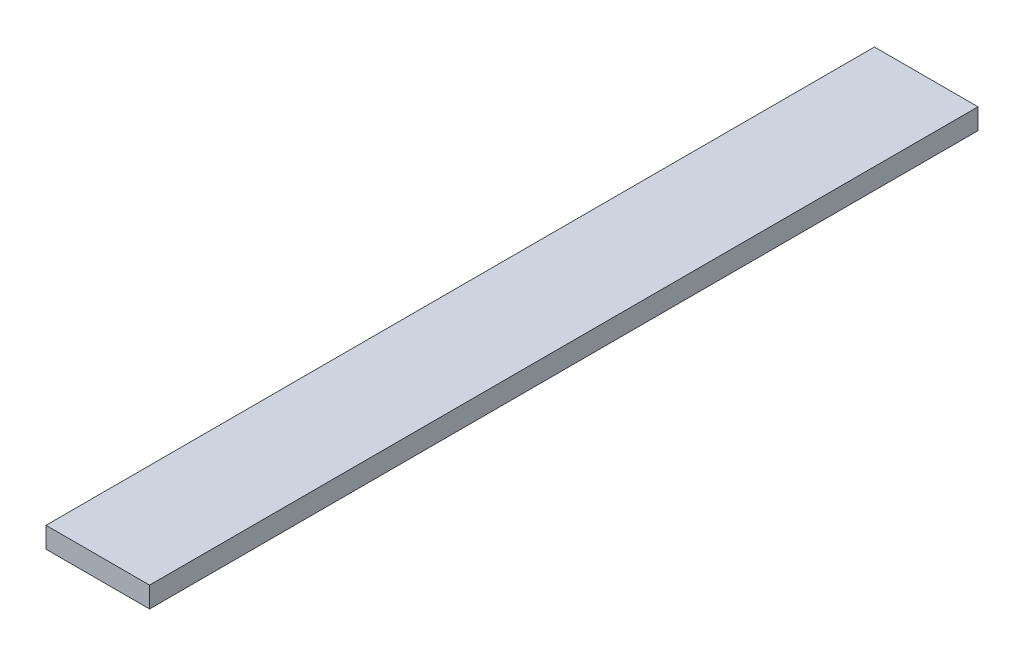
ISO-10303-21;
HEADER;
FILE_DESCRIPTION(('STEP AP214'),'2;1');
FILE_NAME('part.step','',(''),(''),'','','');
FILE_SCHEMA(('AUTOMOTIVE_DESIGN { 1 0 10303 214 1 1 1 1 }'));
ENDSEC;
DATA;
#1=APPLICATION_CONTEXT('core data for automotive mechanical design processes');
#2=APPLICATION_PROTOCOL_DEFINITION('international standard','automotive_design',2000,#1);
#3=PRODUCT_CONTEXT('',#1,'mechanical');
#4=PRODUCT('Part','Part','',(#3));
#5=PRODUCT_RELATED_PRODUCT_CATEGORY('part','',(#4));
#6=PRODUCT_DEFINITION_FORMATION('','',#4);
#7=PRODUCT_DEFINITION_CONTEXT('part definition',#1,'design');
#8=PRODUCT_DEFINITION('design','',#6,#7);
#9=PRODUCT_DEFINITION_SHAPE('','',#8);
#10=(LENGTH_UNIT() NAMED_UNIT(*) SI_UNIT(.MILLI.,.METRE.));
#11=(NAMED_UNIT(*) PLANE_ANGLE_UNIT() SI_UNIT($,.RADIAN.));
#12=(NAMED_UNIT(*) SI_UNIT($,.STERADIAN.) SOLID_ANGLE_UNIT());
#13=UNCERTAINTY_MEASURE_WITH_UNIT(LENGTH_MEASURE(1.E-05),#10,'distance_accuracy_value','');
#14=(GEOMETRIC_REPRESENTATION_CONTEXT(3) GLOBAL_UNCERTAINTY_ASSIGNED_CONTEXT((#13)) GLOBAL_UNIT_ASSIGNED_CONTEXT((#10,
#11,#12)) REPRESENTATION_CONTEXT('',''));
#15=CARTESIAN_POINT('',(0.,0.,0.));
#16=DIRECTION('',(0.,0.,1.));
#17=DIRECTION('',(1.,0.,0.));
#18=AXIS2_PLACEMENT_3D('',#15,#16,#17);
#19=CARTESIAN_POINT('',(7.5,3.,0.));
#20=DIRECTION('',(1.,0.,0.));
#21=DIRECTION('',(0.,0.,-1.));
#22=AXIS2_PLACEMENT_3D('',#19,#20,#21);
#23=PLANE('',#22);
#24=DIRECTION('',(0.,0.,1.));
#25=VECTOR('',#24,1.);
#26=CARTESIAN_POINT('',(7.5,0.,0.));
#27=LINE('',#26,#25);
#28=CARTESIAN_POINT('',(7.49999999999999,0.,-60.));
#29=VERTEX_POINT('',#28);
#30=CARTESIAN_POINT('',(7.50000000000001,0.,60.));
#31=VERTEX_POINT('',#30);
#32=EDGE_CURVE('E114',#29,#31,#27,.T.);
#33=ORIENTED_EDGE('',*,*,#32,.F.);
#34=DIRECTION('',(0.,-1.,0.));
#35=VECTOR('',#34,1.);
#36=CARTESIAN_POINT('',(7.49999999999999,3.,-60.));
#37=LINE('',#36,#35);
#38=CARTESIAN_POINT('',(7.49999999999999,3.,-60.));
#39=VERTEX_POINT('',#38);
#40=EDGE_CURVE('E11',#39,#29,#37,.T.);
#41=ORIENTED_EDGE('',*,*,#40,.F.);
#42=DIRECTION('',(0.,0.,1.));
#43=VECTOR('',#42,1.);
#44=CARTESIAN_POINT('',(7.5,3.,0.));
#45=LINE('',#44,#43);
#46=CARTESIAN_POINT('',(7.50000000000001,3.,60.));
#47=VERTEX_POINT('',#46);
#48=EDGE_CURVE('E105',#39,#47,#45,.T.);
#49=ORIENTED_EDGE('',*,*,#48,.T.);
#50=DIRECTION('',(0.,-1.,0.));
#51=VECTOR('',#50,1.);
#52=CARTESIAN_POINT('',(7.50000000000001,3.,60.));
#53=LINE('',#52,#51);
#54=EDGE_CURVE('E84',#47,#31,#53,.T.);
#55=ORIENTED_EDGE('',*,*,#54,.T.);
#56=EDGE_LOOP('',(#33,#41,#49,#55));
#57=FACE_BOUND('',#56,.T.);
#58=ADVANCED_FACE('F45',(#57),#23,.T.);
#59=CARTESIAN_POINT('',(0.,3.,-60.));
#60=DIRECTION('',(0.,0.,-1.));
#61=DIRECTION('',(-1.,0.,0.));
#62=AXIS2_PLACEMENT_3D('',#59,#60,#61);
#63=PLANE('',#62);
#64=DIRECTION('',(1.,0.,0.));
#65=VECTOR('',#64,1.);
#66=CARTESIAN_POINT('',(0.,0.,-60.));
#67=LINE('',#66,#65);
#68=CARTESIAN_POINT('',(-7.50000000000001,0.,-60.));
#69=VERTEX_POINT('',#68);
#70=EDGE_CURVE('E97',#69,#29,#67,.T.);
#71=ORIENTED_EDGE('',*,*,#70,.F.);
#72=DIRECTION('',(0.,-1.,0.));
#73=VECTOR('',#72,1.);
#74=CARTESIAN_POINT('',(-7.50000000000001,3.,-60.));
#75=LINE('',#74,#73);
#76=CARTESIAN_POINT('',(-7.50000000000001,3.,-60.));
#77=VERTEX_POINT('',#76);
#78=EDGE_CURVE('E54',#77,#69,#75,.T.);
#79=ORIENTED_EDGE('',*,*,#78,.F.);
#80=DIRECTION('',(1.,0.,0.));
#81=VECTOR('',#80,1.);
#82=CARTESIAN_POINT('',(0.,3.,-60.));
#83=LINE('',#82,#81);
#84=EDGE_CURVE('E95',#77,#39,#83,.T.);
#85=ORIENTED_EDGE('',*,*,#84,.T.);
#86=ORIENTED_EDGE('',*,*,#40,.T.);
#87=EDGE_LOOP('',(#71,#79,#85,#86));
#88=FACE_BOUND('',#87,.T.);
#89=ADVANCED_FACE('F93',(#88),#63,.T.);
#90=CARTESIAN_POINT('',(-7.5,3.,0.));
#91=DIRECTION('',(1.,0.,0.));
#92=DIRECTION('',(0.,0.,-1.));
#93=AXIS2_PLACEMENT_3D('',#90,#91,#92);
#94=PLANE('',#93);
#95=DIRECTION('',(0.,0.,1.));
#96=VECTOR('',#95,1.);
#97=CARTESIAN_POINT('',(-7.5,0.,0.));
#98=LINE('',#97,#96);
#99=CARTESIAN_POINT('',(-7.49999999999999,0.,60.));
#100=VERTEX_POINT('',#99);
#101=EDGE_CURVE('E77',#69,#100,#98,.T.);
#102=ORIENTED_EDGE('',*,*,#101,.T.);
#103=DIRECTION('',(0.,-1.,0.));
#104=VECTOR('',#103,1.);
#105=CARTESIAN_POINT('',(-7.49999999999999,3.,60.));
#106=LINE('',#105,#104);
#107=CARTESIAN_POINT('',(-7.49999999999999,3.,60.));
#108=VERTEX_POINT('',#107);
#109=EDGE_CURVE('E99',#108,#100,#106,.T.);
#110=ORIENTED_EDGE('',*,*,#109,.F.);
#111=DIRECTION('',(0.,0.,1.));
#112=VECTOR('',#111,1.);
#113=CARTESIAN_POINT('',(-7.5,3.,0.));
#114=LINE('',#113,#112);
#115=EDGE_CURVE('E100',#77,#108,#114,.T.);
#116=ORIENTED_EDGE('',*,*,#115,.F.);
#117=ORIENTED_EDGE('',*,*,#78,.T.);
#118=EDGE_LOOP('',(#102,#110,#116,#117));
#119=FACE_BOUND('',#118,.T.);
#120=ADVANCED_FACE('F101',(#119),#94,.F.);
#121=CARTESIAN_POINT('',(0.,3.,60.));
#122=DIRECTION('',(0.,0.,-1.));
#123=DIRECTION('',(-1.,0.,0.));
#124=AXIS2_PLACEMENT_3D('',#121,#122,#123);
#125=PLANE('',#124);
#126=DIRECTION('',(1.,0.,0.));
#127=VECTOR('',#126,1.);
#128=CARTESIAN_POINT('',(0.,0.,60.));
#129=LINE('',#128,#127);
#130=EDGE_CURVE('E109',#100,#31,#129,.T.);
#131=ORIENTED_EDGE('',*,*,#130,.T.);
#132=ORIENTED_EDGE('',*,*,#54,.F.);
#133=DIRECTION('',(1.,0.,0.));
#134=VECTOR('',#133,1.);
#135=CARTESIAN_POINT('',(0.,3.,60.));
#136=LINE('',#135,#134);
#137=EDGE_CURVE('E62',#108,#47,#136,.T.);
#138=ORIENTED_EDGE('',*,*,#137,.F.);
#139=ORIENTED_EDGE('',*,*,#109,.T.);
#140=EDGE_LOOP('',(#131,#132,#138,#139));
#141=FACE_BOUND('',#140,.T.);
#142=ADVANCED_FACE('F129',(#141),#125,.F.);
#143=CARTESIAN_POINT('',(0.,3.,0.));
#144=DIRECTION('',(0.,1.,0.));
#145=DIRECTION('',(0.,0.,1.));
#146=AXIS2_PLACEMENT_3D('',#143,#144,#145);
#147=PLANE('',#146);
#148=ORIENTED_EDGE('',*,*,#48,.F.);
#149=ORIENTED_EDGE('',*,*,#84,.F.);
#150=ORIENTED_EDGE('',*,*,#115,.T.);
#151=ORIENTED_EDGE('',*,*,#137,.T.);
#152=EDGE_LOOP('',(#148,#149,#150,#151));
#153=FACE_BOUND('',#152,.T.);
#154=ADVANCED_FACE('F104',(#153),#147,.T.);
#155=CARTESIAN_POINT('',(0.,0.,0.));
#156=DIRECTION('',(0.,1.,0.));
#157=DIRECTION('',(0.,0.,1.));
#158=AXIS2_PLACEMENT_3D('',#155,#156,#157);
#159=PLANE('',#158);
#160=ORIENTED_EDGE('',*,*,#32,.T.);
#161=ORIENTED_EDGE('',*,*,#130,.F.);
#162=ORIENTED_EDGE('',*,*,#101,.F.);
#163=ORIENTED_EDGE('',*,*,#70,.T.);
#164=EDGE_LOOP('',(#160,#161,#162,#163));
#165=FACE_BOUND('',#164,.T.);
#166=ADVANCED_FACE('F131',(#165),#159,.F.);
#167=CLOSED_SHELL('',(#58,#89,#120,#142,#154,#166));
#168=MANIFOLD_SOLID_BREP('B2',#167);
#169=ADVANCED_BREP_SHAPE_REPRESENTATION('',(#18,#168),#14);
#170=SHAPE_DEFINITION_REPRESENTATION(#9,#169);
ENDSEC;
END-ISO-10303-21;
